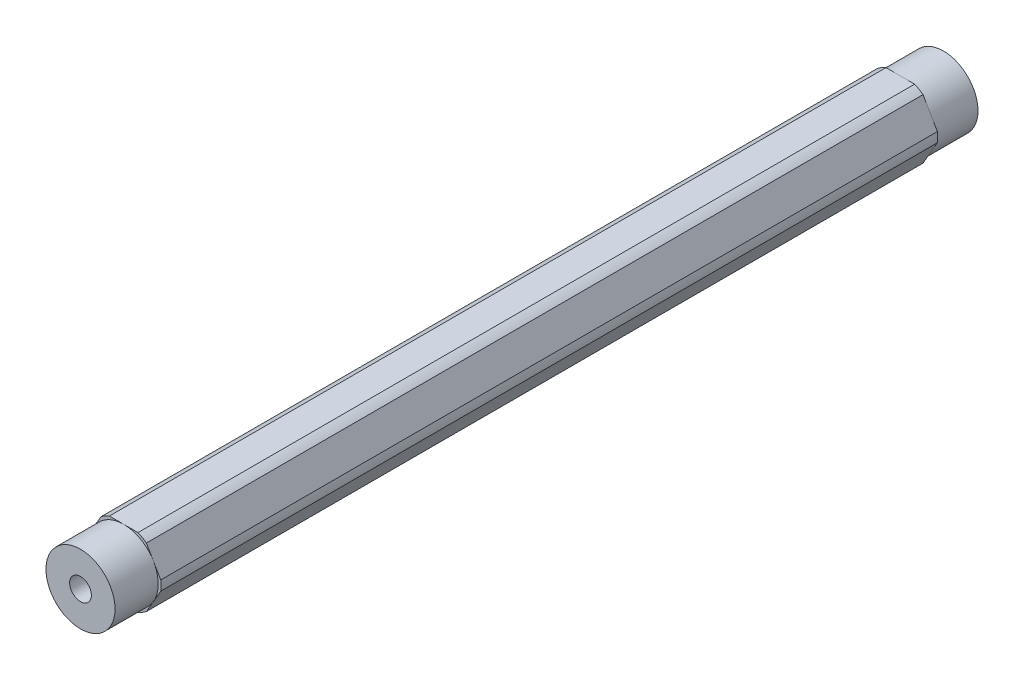
ISO-10303-21;
HEADER;
FILE_DESCRIPTION(('STEP AP214'),'2;1');
FILE_NAME('part.step','',(''),(''),'','','');
FILE_SCHEMA(('AUTOMOTIVE_DESIGN { 1 0 10303 214 1 1 1 1 }'));
ENDSEC;
DATA;
#1=APPLICATION_CONTEXT('core data for automotive mechanical design processes');
#2=APPLICATION_PROTOCOL_DEFINITION('international standard','automotive_design',2000,#1);
#3=PRODUCT_CONTEXT('',#1,'mechanical');
#4=PRODUCT('Part','Part','',(#3));
#5=PRODUCT_RELATED_PRODUCT_CATEGORY('part','',(#4));
#6=PRODUCT_DEFINITION_FORMATION('','',#4);
#7=PRODUCT_DEFINITION_CONTEXT('part definition',#1,'design');
#8=PRODUCT_DEFINITION('design','',#6,#7);
#9=PRODUCT_DEFINITION_SHAPE('','',#8);
#10=(LENGTH_UNIT() NAMED_UNIT(*) SI_UNIT(.MILLI.,.METRE.));
#11=(NAMED_UNIT(*) PLANE_ANGLE_UNIT() SI_UNIT($,.RADIAN.));
#12=(NAMED_UNIT(*) SI_UNIT($,.STERADIAN.) SOLID_ANGLE_UNIT());
#13=UNCERTAINTY_MEASURE_WITH_UNIT(LENGTH_MEASURE(1.E-05),#10,'distance_accuracy_value','');
#14=(GEOMETRIC_REPRESENTATION_CONTEXT(3) GLOBAL_UNCERTAINTY_ASSIGNED_CONTEXT((#13)) GLOBAL_UNIT_ASSIGNED_CONTEXT((#10,
#11,#12)) REPRESENTATION_CONTEXT('',''));
#15=CARTESIAN_POINT('',(0.,0.,0.));
#16=DIRECTION('',(0.,0.,1.));
#17=DIRECTION('',(1.,0.,0.));
#18=AXIS2_PLACEMENT_3D('',#15,#16,#17);
#19=CARTESIAN_POINT('',(0.,0.,-71.4121));
#20=DIRECTION('',(0.,0.,1.));
#21=DIRECTION('',(1.,0.,0.));
#22=AXIS2_PLACEMENT_3D('',#19,#20,#21);
#23=PLANE('',#22);
#24=DIRECTION('',(-0.5,0.866025403784439,0.));
#25=VECTOR('',#24,1.);
#26=CARTESIAN_POINT('',(5.49926131403118,3.175,-71.4121));
#27=LINE('',#26,#25);
#28=CARTESIAN_POINT('',(5.49926131403118,3.175,-71.4121));
#29=VERTEX_POINT('',#28);
#30=CARTESIAN_POINT('',(4.18177084608654,5.45696042896782,-71.4121));
#31=VERTEX_POINT('',#30);
#32=EDGE_CURVE('E175',#29,#31,#27,.T.);
#33=ORIENTED_EDGE('',*,*,#32,.F.);
#34=CARTESIAN_POINT('',(0.,0.,-71.4121));
#35=DIRECTION('',(0.,0.,1.));
#36=DIRECTION('',(1.,0.,0.));
#37=AXIS2_PLACEMENT_3D('',#34,#35,#36);
#38=CIRCLE('',#37,6.35);
#39=CARTESIAN_POINT('',(0.,6.35,-71.4121));
#40=VERTEX_POINT('',#39);
#41=EDGE_CURVE('E50',#29,#40,#38,.T.);
#42=ORIENTED_EDGE('',*,*,#41,.T.);
#43=DIRECTION('',(-1.,0.,0.));
#44=VECTOR('',#43,1.);
#45=CARTESIAN_POINT('',(0.,6.35,-71.4121));
#46=LINE('',#45,#44);
#47=CARTESIAN_POINT('',(2.63498093588929,6.35,-71.4121));
#48=VERTEX_POINT('',#47);
#49=EDGE_CURVE('E174',#48,#40,#46,.T.);
#50=ORIENTED_EDGE('',*,*,#49,.F.);
#51=CARTESIAN_POINT('',(0.,0.,-71.4121));
#52=DIRECTION('',(0.,0.,1.));
#53=DIRECTION('',(1.,0.,0.));
#54=AXIS2_PLACEMENT_3D('',#51,#52,#53);
#55=CIRCLE('',#54,6.874999966);
#56=EDGE_CURVE('E187',#31,#48,#55,.T.);
#57=ORIENTED_EDGE('',*,*,#56,.F.);
#58=EDGE_LOOP('',(#33,#42,#50,#57));
#59=FACE_BOUND('',#58,.T.);
#60=ADVANCED_FACE('F39',(#59),#23,.F.);
#61=CARTESIAN_POINT('',(-2.63498093588929,6.35,-71.4121));
#62=VERTEX_POINT('',#61);
#63=EDGE_CURVE('E181',#40,#62,#46,.T.);
#64=ORIENTED_EDGE('',*,*,#63,.F.);
#65=CARTESIAN_POINT('',(-5.49926131403118,3.175,-71.4121));
#66=VERTEX_POINT('',#65);
#67=EDGE_CURVE('E11',#40,#66,#38,.T.);
#68=ORIENTED_EDGE('',*,*,#67,.T.);
#69=DIRECTION('',(-0.5,-0.866025403784438,0.));
#70=VECTOR('',#69,1.);
#71=CARTESIAN_POINT('',(-5.49926131403118,3.175,-71.4121));
#72=LINE('',#71,#70);
#73=CARTESIAN_POINT('',(-4.18177084608654,5.45696042896783,-71.4121));
#74=VERTEX_POINT('',#73);
#75=EDGE_CURVE('E199',#74,#66,#72,.T.);
#76=ORIENTED_EDGE('',*,*,#75,.F.);
#77=EDGE_CURVE('E183',#62,#74,#55,.T.);
#78=ORIENTED_EDGE('',*,*,#77,.F.);
#79=EDGE_LOOP('',(#64,#68,#76,#78));
#80=FACE_BOUND('',#79,.T.);
#81=ADVANCED_FACE('F182',(#80),#23,.F.);
#82=CARTESIAN_POINT('',(-6.81675178197583,0.893039571032178,-71.4121));
#83=VERTEX_POINT('',#82);
#84=EDGE_CURVE('E194',#66,#83,#72,.T.);
#85=ORIENTED_EDGE('',*,*,#84,.F.);
#86=CARTESIAN_POINT('',(-5.49926131403118,-3.175,-71.4121));
#87=VERTEX_POINT('',#86);
#88=EDGE_CURVE('E48',#66,#87,#38,.T.);
#89=ORIENTED_EDGE('',*,*,#88,.T.);
#90=DIRECTION('',(0.5,-0.866025403784438,0.));
#91=VECTOR('',#90,1.);
#92=CARTESIAN_POINT('',(-5.49926131403118,-3.175,-71.4121));
#93=LINE('',#92,#91);
#94=CARTESIAN_POINT('',(-6.81675178197583,-0.893039571032174,-71.4121));
#95=VERTEX_POINT('',#94);
#96=EDGE_CURVE('E202',#95,#87,#93,.T.);
#97=ORIENTED_EDGE('',*,*,#96,.F.);
#98=EDGE_CURVE('E196',#83,#95,#55,.T.);
#99=ORIENTED_EDGE('',*,*,#98,.F.);
#100=EDGE_LOOP('',(#85,#89,#97,#99));
#101=FACE_BOUND('',#100,.T.);
#102=ADVANCED_FACE('F376',(#101),#23,.F.);
#103=CARTESIAN_POINT('',(-4.18177084608653,-5.45696042896783,-71.4121));
#104=VERTEX_POINT('',#103);
#105=EDGE_CURVE('E206',#87,#104,#93,.T.);
#106=ORIENTED_EDGE('',*,*,#105,.F.);
#107=CARTESIAN_POINT('',(0.,-6.35,-71.4121));
#108=VERTEX_POINT('',#107);
#109=EDGE_CURVE('E340',#87,#108,#38,.T.);
#110=ORIENTED_EDGE('',*,*,#109,.T.);
#111=DIRECTION('',(1.,0.,0.));
#112=VECTOR('',#111,1.);
#113=CARTESIAN_POINT('',(0.,-6.35,-71.4121));
#114=LINE('',#113,#112);
#115=CARTESIAN_POINT('',(-2.6349809358893,-6.35,-71.4121));
#116=VERTEX_POINT('',#115);
#117=EDGE_CURVE('E207',#116,#108,#114,.T.);
#118=ORIENTED_EDGE('',*,*,#117,.F.);
#119=EDGE_CURVE('E205',#104,#116,#55,.T.);
#120=ORIENTED_EDGE('',*,*,#119,.F.);
#121=EDGE_LOOP('',(#106,#110,#118,#120));
#122=FACE_BOUND('',#121,.T.);
#123=ADVANCED_FACE('F339',(#122),#23,.F.);
#124=CARTESIAN_POINT('',(2.6349809358893,-6.35,-71.4121));
#125=VERTEX_POINT('',#124);
#126=EDGE_CURVE('E211',#108,#125,#114,.T.);
#127=ORIENTED_EDGE('',*,*,#126,.F.);
#128=CARTESIAN_POINT('',(5.49926131403118,-3.175,-71.4121));
#129=VERTEX_POINT('',#128);
#130=EDGE_CURVE('E269',#108,#129,#38,.T.);
#131=ORIENTED_EDGE('',*,*,#130,.T.);
#132=DIRECTION('',(0.5,0.866025403784439,0.));
#133=VECTOR('',#132,1.);
#134=CARTESIAN_POINT('',(5.49926131403119,-3.175,-71.4121));
#135=LINE('',#134,#133);
#136=CARTESIAN_POINT('',(4.18177084608654,-5.45696042896782,-71.4121));
#137=VERTEX_POINT('',#136);
#138=EDGE_CURVE('E212',#137,#129,#135,.T.);
#139=ORIENTED_EDGE('',*,*,#138,.F.);
#140=EDGE_CURVE('E210',#125,#137,#55,.T.);
#141=ORIENTED_EDGE('',*,*,#140,.F.);
#142=EDGE_LOOP('',(#127,#131,#139,#141));
#143=FACE_BOUND('',#142,.T.);
#144=ADVANCED_FACE('F360',(#143),#23,.F.);
#145=CARTESIAN_POINT('',(0.,0.,71.4121));
#146=DIRECTION('',(0.,0.,1.));
#147=DIRECTION('',(1.,0.,0.));
#148=AXIS2_PLACEMENT_3D('',#145,#146,#147);
#149=PLANE('',#148);
#150=CARTESIAN_POINT('',(0.,0.,71.4121));
#151=DIRECTION('',(0.,0.,1.));
#152=DIRECTION('',(1.,0.,0.));
#153=AXIS2_PLACEMENT_3D('',#150,#151,#152);
#154=CIRCLE('',#153,6.35);
#155=CARTESIAN_POINT('',(5.49926131403118,3.175,71.4121));
#156=VERTEX_POINT('',#155);
#157=CARTESIAN_POINT('',(0.,6.35,71.4121));
#158=VERTEX_POINT('',#157);
#159=EDGE_CURVE('E252',#156,#158,#154,.T.);
#160=ORIENTED_EDGE('',*,*,#159,.F.);
#161=DIRECTION('',(-0.5,0.866025403784439,0.));
#162=VECTOR('',#161,1.);
#163=CARTESIAN_POINT('',(5.49926131403118,3.175,71.4121));
#164=LINE('',#163,#162);
#165=CARTESIAN_POINT('',(4.18177084608654,5.45696042896782,71.4121));
#166=VERTEX_POINT('',#165);
#167=EDGE_CURVE('E320',#156,#166,#164,.T.);
#168=ORIENTED_EDGE('',*,*,#167,.T.);
#169=CARTESIAN_POINT('',(0.,0.,71.4121));
#170=DIRECTION('',(0.,0.,1.));
#171=DIRECTION('',(1.,0.,0.));
#172=AXIS2_PLACEMENT_3D('',#169,#170,#171);
#173=CIRCLE('',#172,6.874999966);
#174=CARTESIAN_POINT('',(2.63498093588929,6.35,71.4121));
#175=VERTEX_POINT('',#174);
#176=EDGE_CURVE('E311',#166,#175,#173,.T.);
#177=ORIENTED_EDGE('',*,*,#176,.T.);
#178=DIRECTION('',(-1.,0.,0.));
#179=VECTOR('',#178,1.);
#180=CARTESIAN_POINT('',(0.,6.35,71.4121));
#181=LINE('',#180,#179);
#182=EDGE_CURVE('E314',#175,#158,#181,.T.);
#183=ORIENTED_EDGE('',*,*,#182,.T.);
#184=EDGE_LOOP('',(#160,#168,#177,#183));
#185=FACE_BOUND('',#184,.T.);
#186=ADVANCED_FACE('F357',(#185),#149,.T.);
#187=CARTESIAN_POINT('',(-5.49926131403118,3.175,71.4121));
#188=VERTEX_POINT('',#187);
#189=EDGE_CURVE('E261',#158,#188,#154,.T.);
#190=ORIENTED_EDGE('',*,*,#189,.F.);
#191=CARTESIAN_POINT('',(-2.63498093588929,6.35,71.4121));
#192=VERTEX_POINT('',#191);
#193=EDGE_CURVE('E315',#158,#192,#181,.T.);
#194=ORIENTED_EDGE('',*,*,#193,.T.);
#195=CARTESIAN_POINT('',(-4.18177084608654,5.45696042896783,71.4121));
#196=VERTEX_POINT('',#195);
#197=EDGE_CURVE('E317',#192,#196,#173,.T.);
#198=ORIENTED_EDGE('',*,*,#197,.T.);
#199=DIRECTION('',(-0.5,-0.866025403784438,0.));
#200=VECTOR('',#199,1.);
#201=CARTESIAN_POINT('',(-5.49926131403118,3.175,71.4121));
#202=LINE('',#201,#200);
#203=EDGE_CURVE('E299',#196,#188,#202,.T.);
#204=ORIENTED_EDGE('',*,*,#203,.T.);
#205=EDGE_LOOP('',(#190,#194,#198,#204));
#206=FACE_BOUND('',#205,.T.);
#207=ADVANCED_FACE('F359',(#206),#149,.T.);
#208=CARTESIAN_POINT('',(-5.49926131403118,-3.175,71.4121));
#209=VERTEX_POINT('',#208);
#210=EDGE_CURVE('E267',#188,#209,#154,.T.);
#211=ORIENTED_EDGE('',*,*,#210,.F.);
#212=CARTESIAN_POINT('',(-6.81675178197583,0.893039571032178,71.4121));
#213=VERTEX_POINT('',#212);
#214=EDGE_CURVE('E318',#188,#213,#202,.T.);
#215=ORIENTED_EDGE('',*,*,#214,.T.);
#216=CARTESIAN_POINT('',(-6.81675178197583,-0.893039571032174,71.4121));
#217=VERTEX_POINT('',#216);
#218=EDGE_CURVE('E286',#213,#217,#173,.T.);
#219=ORIENTED_EDGE('',*,*,#218,.T.);
#220=DIRECTION('',(0.5,-0.866025403784438,0.));
#221=VECTOR('',#220,1.);
#222=CARTESIAN_POINT('',(-5.49926131403118,-3.175,71.4121));
#223=LINE('',#222,#221);
#224=EDGE_CURVE('E284',#217,#209,#223,.T.);
#225=ORIENTED_EDGE('',*,*,#224,.T.);
#226=EDGE_LOOP('',(#211,#215,#219,#225));
#227=FACE_BOUND('',#226,.T.);
#228=ADVANCED_FACE('F289',(#227),#149,.T.);
#229=CARTESIAN_POINT('',(0.,-6.35,71.4121));
#230=VERTEX_POINT('',#229);
#231=EDGE_CURVE('E256',#209,#230,#154,.T.);
#232=ORIENTED_EDGE('',*,*,#231,.F.);
#233=CARTESIAN_POINT('',(-4.18177084608653,-5.45696042896783,71.4121));
#234=VERTEX_POINT('',#233);
#235=EDGE_CURVE('E276',#209,#234,#223,.T.);
#236=ORIENTED_EDGE('',*,*,#235,.T.);
#237=CARTESIAN_POINT('',(-2.6349809358893,-6.35,71.4121));
#238=VERTEX_POINT('',#237);
#239=EDGE_CURVE('E293',#234,#238,#173,.T.);
#240=ORIENTED_EDGE('',*,*,#239,.T.);
#241=DIRECTION('',(1.,0.,0.));
#242=VECTOR('',#241,1.);
#243=CARTESIAN_POINT('',(0.,-6.35,71.4121));
#244=LINE('',#243,#242);
#245=EDGE_CURVE('E279',#238,#230,#244,.T.);
#246=ORIENTED_EDGE('',*,*,#245,.T.);
#247=EDGE_LOOP('',(#232,#236,#240,#246));
#248=FACE_BOUND('',#247,.T.);
#249=ADVANCED_FACE('F275',(#248),#149,.T.);
#250=CARTESIAN_POINT('',(5.49926131403119,-3.175,71.4121));
#251=VERTEX_POINT('',#250);
#252=EDGE_CURVE('E250',#230,#251,#154,.T.);
#253=ORIENTED_EDGE('',*,*,#252,.F.);
#254=CARTESIAN_POINT('',(2.6349809358893,-6.35,71.4121));
#255=VERTEX_POINT('',#254);
#256=EDGE_CURVE('E294',#230,#255,#244,.T.);
#257=ORIENTED_EDGE('',*,*,#256,.T.);
#258=CARTESIAN_POINT('',(4.18177084608654,-5.45696042896782,71.4121));
#259=VERTEX_POINT('',#258);
#260=EDGE_CURVE('E296',#255,#259,#173,.T.);
#261=ORIENTED_EDGE('',*,*,#260,.T.);
#262=DIRECTION('',(0.5,0.866025403784439,0.));
#263=VECTOR('',#262,1.);
#264=CARTESIAN_POINT('',(5.49926131403119,-3.175,71.4121));
#265=LINE('',#264,#263);
#266=EDGE_CURVE('E302',#259,#251,#265,.T.);
#267=ORIENTED_EDGE('',*,*,#266,.T.);
#268=EDGE_LOOP('',(#253,#257,#261,#267));
#269=FACE_BOUND('',#268,.T.);
#270=ADVANCED_FACE('F348',(#269),#149,.T.);
#271=CARTESIAN_POINT('',(5.49926131403118,3.175,71.4121));
#272=DIRECTION('',(-0.866025403784439,-0.5,0.));
#273=DIRECTION('',(0.5,-0.866025403784438,0.));
#274=AXIS2_PLACEMENT_3D('',#271,#272,#273);
#275=PLANE('',#274);
#276=CARTESIAN_POINT('',(6.81675178197583,0.89303957103218,-71.4121));
#277=VERTEX_POINT('',#276);
#278=EDGE_CURVE('E305',#277,#29,#27,.T.);
#279=ORIENTED_EDGE('',*,*,#278,.T.);
#280=ORIENTED_EDGE('',*,*,#32,.T.);
#281=DIRECTION('',(0.,0.,-1.));
#282=VECTOR('',#281,1.);
#283=CARTESIAN_POINT('',(4.18177084608654,5.45696042896782,71.4121));
#284=LINE('',#283,#282);
#285=EDGE_CURVE('E43',#166,#31,#284,.T.);
#286=ORIENTED_EDGE('',*,*,#285,.F.);
#287=ORIENTED_EDGE('',*,*,#167,.F.);
#288=CARTESIAN_POINT('',(6.81675178197583,0.89303957103218,71.4121));
#289=VERTEX_POINT('',#288);
#290=EDGE_CURVE('E319',#289,#156,#164,.T.);
#291=ORIENTED_EDGE('',*,*,#290,.F.);
#292=DIRECTION('',(0.,0.,-1.));
#293=VECTOR('',#292,1.);
#294=CARTESIAN_POINT('',(6.81675178197583,0.89303957103218,71.4121));
#295=LINE('',#294,#293);
#296=EDGE_CURVE('E217',#289,#277,#295,.T.);
#297=ORIENTED_EDGE('',*,*,#296,.T.);
#298=EDGE_LOOP('',(#279,#280,#286,#287,#291,#297));
#299=FACE_BOUND('',#298,.T.);
#300=ADVANCED_FACE('F308',(#299),#275,.F.);
#301=CARTESIAN_POINT('',(0.,0.,71.4121));
#302=DIRECTION('',(0.,0.,-1.));
#303=DIRECTION('',(-1.,0.,0.));
#304=AXIS2_PLACEMENT_3D('',#301,#302,#303);
#305=CYLINDRICAL_SURFACE('',#304,6.874999966);
#306=ORIENTED_EDGE('',*,*,#56,.T.);
#307=DIRECTION('',(0.,0.,-1.));
#308=VECTOR('',#307,1.);
#309=CARTESIAN_POINT('',(2.63498093588929,6.35,71.4121));
#310=LINE('',#309,#308);
#311=EDGE_CURVE('E193',#175,#48,#310,.T.);
#312=ORIENTED_EDGE('',*,*,#311,.F.);
#313=ORIENTED_EDGE('',*,*,#176,.F.);
#314=ORIENTED_EDGE('',*,*,#285,.T.);
#315=EDGE_LOOP('',(#306,#312,#313,#314));
#316=FACE_BOUND('',#315,.T.);
#317=ADVANCED_FACE('F310',(#316),#305,.T.);
#318=CARTESIAN_POINT('',(0.,6.35,71.4121));
#319=DIRECTION('',(0.,-1.,0.));
#320=DIRECTION('',(0.,0.,-1.));
#321=AXIS2_PLACEMENT_3D('',#318,#319,#320);
#322=PLANE('',#321);
#323=ORIENTED_EDGE('',*,*,#49,.T.);
#324=ORIENTED_EDGE('',*,*,#63,.T.);
#325=DIRECTION('',(0.,0.,-1.));
#326=VECTOR('',#325,1.);
#327=CARTESIAN_POINT('',(-2.63498093588929,6.35,71.4121));
#328=LINE('',#327,#326);
#329=EDGE_CURVE('E245',#192,#62,#328,.T.);
#330=ORIENTED_EDGE('',*,*,#329,.F.);
#331=ORIENTED_EDGE('',*,*,#193,.F.);
#332=ORIENTED_EDGE('',*,*,#182,.F.);
#333=ORIENTED_EDGE('',*,*,#311,.T.);
#334=EDGE_LOOP('',(#323,#324,#330,#331,#332,#333));
#335=FACE_BOUND('',#334,.T.);
#336=ADVANCED_FACE('F190',(#335),#322,.F.);
#337=ORIENTED_EDGE('',*,*,#77,.T.);
#338=DIRECTION('',(0.,0.,-1.));
#339=VECTOR('',#338,1.);
#340=CARTESIAN_POINT('',(-4.18177084608654,5.45696042896783,71.4121));
#341=LINE('',#340,#339);
#342=EDGE_CURVE('E242',#196,#74,#341,.T.);
#343=ORIENTED_EDGE('',*,*,#342,.F.);
#344=ORIENTED_EDGE('',*,*,#197,.F.);
#345=ORIENTED_EDGE('',*,*,#329,.T.);
#346=EDGE_LOOP('',(#337,#343,#344,#345));
#347=FACE_BOUND('',#346,.T.);
#348=ADVANCED_FACE('F419',(#347),#305,.T.);
#349=CARTESIAN_POINT('',(-5.49926131403118,3.175,71.4121));
#350=DIRECTION('',(0.866025403784439,-0.5,0.));
#351=DIRECTION('',(0.5,0.866025403784439,0.));
#352=AXIS2_PLACEMENT_3D('',#349,#350,#351);
#353=PLANE('',#352);
#354=ORIENTED_EDGE('',*,*,#75,.T.);
#355=ORIENTED_EDGE('',*,*,#84,.T.);
#356=DIRECTION('',(0.,0.,-1.));
#357=VECTOR('',#356,1.);
#358=CARTESIAN_POINT('',(-6.81675178197583,0.893039571032178,71.4121));
#359=LINE('',#358,#357);
#360=EDGE_CURVE('E239',#213,#83,#359,.T.);
#361=ORIENTED_EDGE('',*,*,#360,.F.);
#362=ORIENTED_EDGE('',*,*,#214,.F.);
#363=ORIENTED_EDGE('',*,*,#203,.F.);
#364=ORIENTED_EDGE('',*,*,#342,.T.);
#365=EDGE_LOOP('',(#354,#355,#361,#362,#363,#364));
#366=FACE_BOUND('',#365,.T.);
#367=ADVANCED_FACE('F416',(#366),#353,.F.);
#368=ORIENTED_EDGE('',*,*,#98,.T.);
#369=DIRECTION('',(0.,0.,-1.));
#370=VECTOR('',#369,1.);
#371=CARTESIAN_POINT('',(-6.81675178197583,-0.893039571032174,71.4121));
#372=LINE('',#371,#370);
#373=EDGE_CURVE('E236',#217,#95,#372,.T.);
#374=ORIENTED_EDGE('',*,*,#373,.F.);
#375=ORIENTED_EDGE('',*,*,#218,.F.);
#376=ORIENTED_EDGE('',*,*,#360,.T.);
#377=EDGE_LOOP('',(#368,#374,#375,#376));
#378=FACE_BOUND('',#377,.T.);
#379=ADVANCED_FACE('F415',(#378),#305,.T.);
#380=CARTESIAN_POINT('',(-5.49926131403118,-3.175,71.4121));
#381=DIRECTION('',(0.866025403784439,0.5,0.));
#382=DIRECTION('',(-0.5,0.866025403784439,0.));
#383=AXIS2_PLACEMENT_3D('',#380,#381,#382);
#384=PLANE('',#383);
#385=ORIENTED_EDGE('',*,*,#96,.T.);
#386=ORIENTED_EDGE('',*,*,#105,.T.);
#387=DIRECTION('',(0.,0.,-1.));
#388=VECTOR('',#387,1.);
#389=CARTESIAN_POINT('',(-4.18177084608653,-5.45696042896783,71.4121));
#390=LINE('',#389,#388);
#391=EDGE_CURVE('E233',#234,#104,#390,.T.);
#392=ORIENTED_EDGE('',*,*,#391,.F.);
#393=ORIENTED_EDGE('',*,*,#235,.F.);
#394=ORIENTED_EDGE('',*,*,#224,.F.);
#395=ORIENTED_EDGE('',*,*,#373,.T.);
#396=EDGE_LOOP('',(#385,#386,#392,#393,#394,#395));
#397=FACE_BOUND('',#396,.T.);
#398=ADVANCED_FACE('F283',(#397),#384,.F.);
#399=ORIENTED_EDGE('',*,*,#119,.T.);
#400=DIRECTION('',(0.,0.,-1.));
#401=VECTOR('',#400,1.);
#402=CARTESIAN_POINT('',(-2.6349809358893,-6.35,71.4121));
#403=LINE('',#402,#401);
#404=EDGE_CURVE('E230',#238,#116,#403,.T.);
#405=ORIENTED_EDGE('',*,*,#404,.F.);
#406=ORIENTED_EDGE('',*,*,#239,.F.);
#407=ORIENTED_EDGE('',*,*,#391,.T.);
#408=EDGE_LOOP('',(#399,#405,#406,#407));
#409=FACE_BOUND('',#408,.T.);
#410=ADVANCED_FACE('F337',(#409),#305,.T.);
#411=CARTESIAN_POINT('',(0.,-6.35,71.4121));
#412=DIRECTION('',(0.,1.,0.));
#413=DIRECTION('',(0.,0.,1.));
#414=AXIS2_PLACEMENT_3D('',#411,#412,#413);
#415=PLANE('',#414);
#416=ORIENTED_EDGE('',*,*,#117,.T.);
#417=ORIENTED_EDGE('',*,*,#126,.T.);
#418=DIRECTION('',(0.,0.,-1.));
#419=VECTOR('',#418,1.);
#420=CARTESIAN_POINT('',(2.6349809358893,-6.35,71.4121));
#421=LINE('',#420,#419);
#422=EDGE_CURVE('E227',#255,#125,#421,.T.);
#423=ORIENTED_EDGE('',*,*,#422,.F.);
#424=ORIENTED_EDGE('',*,*,#256,.F.);
#425=ORIENTED_EDGE('',*,*,#245,.F.);
#426=ORIENTED_EDGE('',*,*,#404,.T.);
#427=EDGE_LOOP('',(#416,#417,#423,#424,#425,#426));
#428=FACE_BOUND('',#427,.T.);
#429=ADVANCED_FACE('F343',(#428),#415,.F.);
#430=ORIENTED_EDGE('',*,*,#140,.T.);
#431=DIRECTION('',(0.,0.,-1.));
#432=VECTOR('',#431,1.);
#433=CARTESIAN_POINT('',(4.18177084608654,-5.45696042896782,71.4121));
#434=LINE('',#433,#432);
#435=EDGE_CURVE('E224',#259,#137,#434,.T.);
#436=ORIENTED_EDGE('',*,*,#435,.F.);
#437=ORIENTED_EDGE('',*,*,#260,.F.);
#438=ORIENTED_EDGE('',*,*,#422,.T.);
#439=EDGE_LOOP('',(#430,#436,#437,#438));
#440=FACE_BOUND('',#439,.T.);
#441=ADVANCED_FACE('F403',(#440),#305,.T.);
#442=CARTESIAN_POINT('',(5.49926131403119,-3.175,71.4121));
#443=DIRECTION('',(-0.866025403784439,0.5,0.));
#444=DIRECTION('',(-0.5,-0.866025403784439,0.));
#445=AXIS2_PLACEMENT_3D('',#442,#443,#444);
#446=PLANE('',#445);
#447=ORIENTED_EDGE('',*,*,#138,.T.);
#448=CARTESIAN_POINT('',(6.81675178197583,-0.893039571032182,-71.4121));
#449=VERTEX_POINT('',#448);
#450=EDGE_CURVE('E216',#129,#449,#135,.T.);
#451=ORIENTED_EDGE('',*,*,#450,.T.);
#452=DIRECTION('',(0.,0.,-1.));
#453=VECTOR('',#452,1.);
#454=CARTESIAN_POINT('',(6.81675178197583,-0.893039571032182,71.4121));
#455=LINE('',#454,#453);
#456=CARTESIAN_POINT('',(6.81675178197583,-0.893039571032182,71.4121));
#457=VERTEX_POINT('',#456);
#458=EDGE_CURVE('E220',#457,#449,#455,.T.);
#459=ORIENTED_EDGE('',*,*,#458,.F.);
#460=EDGE_CURVE('E304',#251,#457,#265,.T.);
#461=ORIENTED_EDGE('',*,*,#460,.F.);
#462=ORIENTED_EDGE('',*,*,#266,.F.);
#463=ORIENTED_EDGE('',*,*,#435,.T.);
#464=EDGE_LOOP('',(#447,#451,#459,#461,#462,#463));
#465=FACE_BOUND('',#464,.T.);
#466=ADVANCED_FACE('F351',(#465),#446,.F.);
#467=CARTESIAN_POINT('',(0.,0.,71.4121));
#468=DIRECTION('',(0.,0.,-1.));
#469=DIRECTION('',(-1.,0.,0.));
#470=AXIS2_PLACEMENT_3D('',#467,#468,#469);
#471=CYLINDRICAL_SURFACE('',#470,2.000000064);
#472=CARTESIAN_POINT('',(0.,0.,79.3496));
#473=DIRECTION('',(0.,0.,1.));
#474=DIRECTION('',(1.,0.,0.));
#475=AXIS2_PLACEMENT_3D('',#472,#473,#474);
#476=CIRCLE('',#475,2.000000064);
#477=CARTESIAN_POINT('',(2.000000064,0.,79.3496));
#478=VERTEX_POINT('',#477);
#479=EDGE_CURVE('E260',#478,#478,#476,.T.);
#480=ORIENTED_EDGE('',*,*,#479,.T.);
#481=EDGE_LOOP('',(#480));
#482=FACE_BOUND('',#481,.T.);
#483=CARTESIAN_POINT('',(0.,0.,-79.3496));
#484=DIRECTION('',(0.,0.,1.));
#485=DIRECTION('',(1.,0.,0.));
#486=AXIS2_PLACEMENT_3D('',#483,#484,#485);
#487=CIRCLE('',#486,2.000000064);
#488=CARTESIAN_POINT('',(2.000000064,0.,-79.3496));
#489=VERTEX_POINT('',#488);
#490=EDGE_CURVE('E178',#489,#489,#487,.T.);
#491=ORIENTED_EDGE('',*,*,#490,.F.);
#492=EDGE_LOOP('',(#491));
#493=FACE_BOUND('',#492,.T.);
#494=ADVANCED_FACE('F41',(#482,#493),#471,.F.);
#495=EDGE_CURVE('E215',#449,#277,#55,.T.);
#496=ORIENTED_EDGE('',*,*,#495,.T.);
#497=ORIENTED_EDGE('',*,*,#296,.F.);
#498=EDGE_CURVE('E221',#457,#289,#173,.T.);
#499=ORIENTED_EDGE('',*,*,#498,.F.);
#500=ORIENTED_EDGE('',*,*,#458,.T.);
#501=EDGE_LOOP('',(#496,#497,#499,#500));
#502=FACE_BOUND('',#501,.T.);
#503=ADVANCED_FACE('F356',(#502),#305,.T.);
#504=EDGE_CURVE('E64',#251,#156,#154,.T.);
#505=ORIENTED_EDGE('',*,*,#504,.F.);
#506=ORIENTED_EDGE('',*,*,#460,.T.);
#507=ORIENTED_EDGE('',*,*,#498,.T.);
#508=ORIENTED_EDGE('',*,*,#290,.T.);
#509=EDGE_LOOP('',(#505,#506,#507,#508));
#510=FACE_BOUND('',#509,.T.);
#511=ADVANCED_FACE('F355',(#510),#149,.T.);
#512=ORIENTED_EDGE('',*,*,#450,.F.);
#513=EDGE_CURVE('E179',#129,#29,#38,.T.);
#514=ORIENTED_EDGE('',*,*,#513,.T.);
#515=ORIENTED_EDGE('',*,*,#278,.F.);
#516=ORIENTED_EDGE('',*,*,#495,.F.);
#517=EDGE_LOOP('',(#512,#514,#515,#516));
#518=FACE_BOUND('',#517,.T.);
#519=ADVANCED_FACE('F369',(#518),#23,.F.);
#520=CARTESIAN_POINT('',(0.,0.,79.3496));
#521=DIRECTION('',(0.,0.,1.));
#522=DIRECTION('',(1.,0.,0.));
#523=AXIS2_PLACEMENT_3D('',#520,#521,#522);
#524=PLANE('',#523);
#525=CARTESIAN_POINT('',(0.,0.,79.3496));
#526=DIRECTION('',(0.,0.,1.));
#527=DIRECTION('',(1.,0.,0.));
#528=AXIS2_PLACEMENT_3D('',#525,#526,#527);
#529=CIRCLE('',#528,6.35);
#530=CARTESIAN_POINT('',(6.35,0.,79.3496));
#531=VERTEX_POINT('',#530);
#532=EDGE_CURVE('E259',#531,#531,#529,.T.);
#533=ORIENTED_EDGE('',*,*,#532,.T.);
#534=EDGE_LOOP('',(#533));
#535=FACE_BOUND('',#534,.T.);
#536=ORIENTED_EDGE('',*,*,#479,.F.);
#537=EDGE_LOOP('',(#536));
#538=FACE_BOUND('',#537,.T.);
#539=ADVANCED_FACE('F379',(#535,#538),#524,.T.);
#540=CARTESIAN_POINT('',(0.,0.,79.3496));
#541=DIRECTION('',(0.,0.,-1.));
#542=DIRECTION('',(-1.,0.,0.));
#543=AXIS2_PLACEMENT_3D('',#540,#541,#542);
#544=CYLINDRICAL_SURFACE('',#543,6.35);
#545=ORIENTED_EDGE('',*,*,#532,.F.);
#546=EDGE_LOOP('',(#545));
#547=FACE_BOUND('',#546,.T.);
#548=ORIENTED_EDGE('',*,*,#159,.T.);
#549=ORIENTED_EDGE('',*,*,#189,.T.);
#550=ORIENTED_EDGE('',*,*,#210,.T.);
#551=ORIENTED_EDGE('',*,*,#231,.T.);
#552=ORIENTED_EDGE('',*,*,#252,.T.);
#553=ORIENTED_EDGE('',*,*,#504,.T.);
#554=EDGE_LOOP('',(#548,#549,#550,#551,#552,#553));
#555=FACE_BOUND('',#554,.T.);
#556=ADVANCED_FACE('F271',(#547,#555),#544,.T.);
#557=CARTESIAN_POINT('',(0.,0.,-79.3496));
#558=DIRECTION('',(0.,0.,1.));
#559=DIRECTION('',(1.,0.,0.));
#560=AXIS2_PLACEMENT_3D('',#557,#558,#559);
#561=CYLINDRICAL_SURFACE('',#560,6.35);
#562=CARTESIAN_POINT('',(0.,0.,-79.3496));
#563=DIRECTION('',(0.,0.,1.));
#564=DIRECTION('',(1.,0.,0.));
#565=AXIS2_PLACEMENT_3D('',#562,#563,#564);
#566=CIRCLE('',#565,6.35);
#567=CARTESIAN_POINT('',(6.35,0.,-79.3496));
#568=VERTEX_POINT('',#567);
#569=EDGE_CURVE('E177',#568,#568,#566,.T.);
#570=ORIENTED_EDGE('',*,*,#569,.T.);
#571=EDGE_LOOP('',(#570));
#572=FACE_BOUND('',#571,.T.);
#573=ORIENTED_EDGE('',*,*,#41,.F.);
#574=ORIENTED_EDGE('',*,*,#513,.F.);
#575=ORIENTED_EDGE('',*,*,#130,.F.);
#576=ORIENTED_EDGE('',*,*,#109,.F.);
#577=ORIENTED_EDGE('',*,*,#88,.F.);
#578=ORIENTED_EDGE('',*,*,#67,.F.);
#579=EDGE_LOOP('',(#573,#574,#575,#576,#577,#578));
#580=FACE_BOUND('',#579,.T.);
#581=ADVANCED_FACE('F163',(#572,#580),#561,.T.);
#582=CARTESIAN_POINT('',(0.,0.,-79.3496));
#583=DIRECTION('',(0.,0.,-1.));
#584=DIRECTION('',(1.,0.,0.));
#585=AXIS2_PLACEMENT_3D('',#582,#583,#584);
#586=PLANE('',#585);
#587=ORIENTED_EDGE('',*,*,#490,.T.);
#588=EDGE_LOOP('',(#587));
#589=FACE_BOUND('',#588,.T.);
#590=ORIENTED_EDGE('',*,*,#569,.F.);
#591=EDGE_LOOP('',(#590));
#592=FACE_BOUND('',#591,.T.);
#593=ADVANCED_FACE('F394',(#589,#592),#586,.T.);
#594=CLOSED_SHELL('',(#60,#81,#102,#123,#144,#186,#207,#228,#249,#270,#300,#317,#336,#348,#367,
#379,#398,#410,#429,#441,#466,#494,#503,#511,#519,#539,#556,#581,#593));
#595=MANIFOLD_SOLID_BREP('B2',#594);
#596=ADVANCED_BREP_SHAPE_REPRESENTATION('',(#18,#595),#14);
#597=SHAPE_DEFINITION_REPRESENTATION(#9,#596);
ENDSEC;
END-ISO-10303-21;
